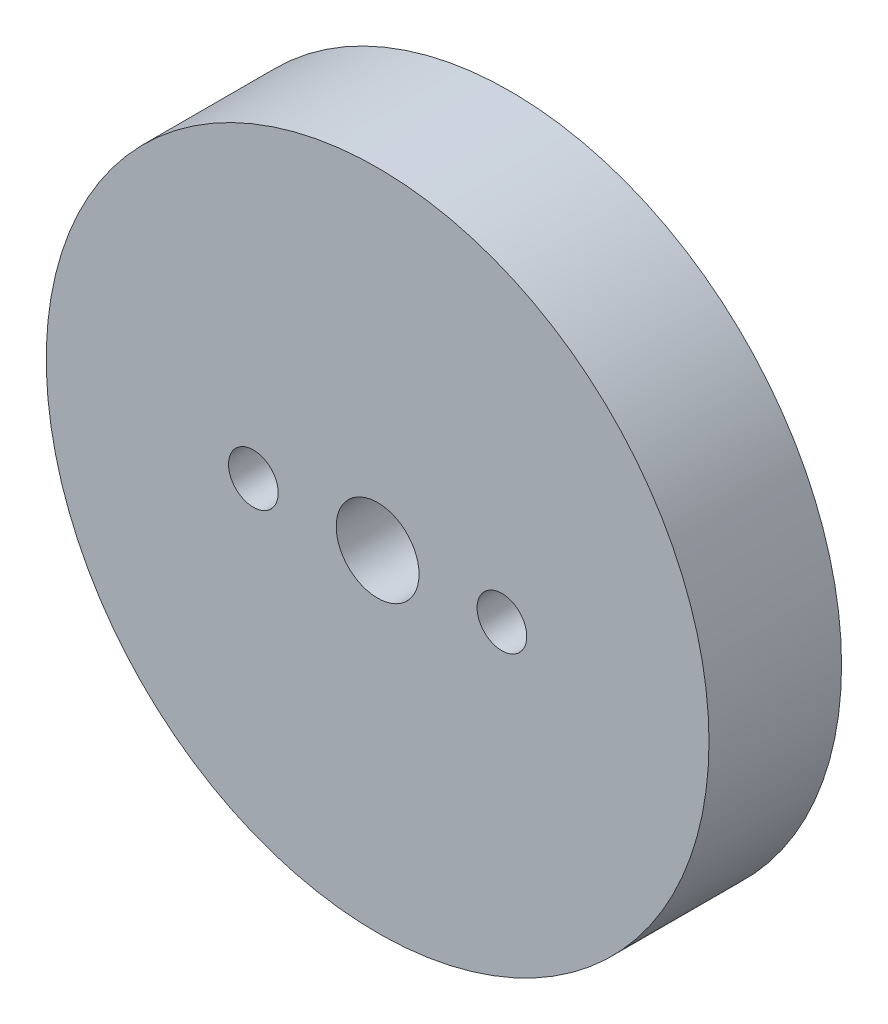
ISO-10303-21;
HEADER;
FILE_DESCRIPTION(('STEP AP214'),'2;1');
FILE_NAME('part.step','',(''),(''),'','','');
FILE_SCHEMA(('AUTOMOTIVE_DESIGN { 1 0 10303 214 1 1 1 1 }'));
ENDSEC;
DATA;
#1=APPLICATION_CONTEXT('core data for automotive mechanical design processes');
#2=APPLICATION_PROTOCOL_DEFINITION('international standard','automotive_design',2000,#1);
#3=PRODUCT_CONTEXT('',#1,'mechanical');
#4=PRODUCT('Part','Part','',(#3));
#5=PRODUCT_RELATED_PRODUCT_CATEGORY('part','',(#4));
#6=PRODUCT_DEFINITION_FORMATION('','',#4);
#7=PRODUCT_DEFINITION_CONTEXT('part definition',#1,'design');
#8=PRODUCT_DEFINITION('design','',#6,#7);
#9=PRODUCT_DEFINITION_SHAPE('','',#8);
#10=(LENGTH_UNIT() NAMED_UNIT(*) SI_UNIT(.MILLI.,.METRE.));
#11=(NAMED_UNIT(*) PLANE_ANGLE_UNIT() SI_UNIT($,.RADIAN.));
#12=(NAMED_UNIT(*) SI_UNIT($,.STERADIAN.) SOLID_ANGLE_UNIT());
#13=UNCERTAINTY_MEASURE_WITH_UNIT(LENGTH_MEASURE(1.E-05),#10,'distance_accuracy_value','');
#14=(GEOMETRIC_REPRESENTATION_CONTEXT(3) GLOBAL_UNCERTAINTY_ASSIGNED_CONTEXT((#13)) GLOBAL_UNIT_ASSIGNED_CONTEXT((#10,
#11,#12)) REPRESENTATION_CONTEXT('',''));
#15=CARTESIAN_POINT('',(0.,0.,0.));
#16=DIRECTION('',(0.,0.,1.));
#17=DIRECTION('',(1.,0.,0.));
#18=AXIS2_PLACEMENT_3D('',#15,#16,#17);
#19=CARTESIAN_POINT('',(0.,0.,8.));
#20=DIRECTION('',(0.,0.,1.));
#21=DIRECTION('',(1.,0.,0.));
#22=AXIS2_PLACEMENT_3D('',#19,#20,#21);
#23=PLANE('',#22);
#24=CARTESIAN_POINT('',(7.5,0.,8.));
#25=DIRECTION('',(0.,0.,1.));
#26=DIRECTION('',(1.,0.,0.));
#27=AXIS2_PLACEMENT_3D('',#24,#25,#26);
#28=CIRCLE('',#27,1.5);
#29=CARTESIAN_POINT('',(9.,0.,8.));
#30=VERTEX_POINT('',#29);
#31=EDGE_CURVE('E47',#30,#30,#28,.T.);
#32=ORIENTED_EDGE('',*,*,#31,.F.);
#33=EDGE_LOOP('',(#32));
#34=FACE_BOUND('',#33,.T.);
#35=CARTESIAN_POINT('',(0.,0.,8.));
#36=DIRECTION('',(0.,0.,1.));
#37=DIRECTION('',(1.,0.,0.));
#38=AXIS2_PLACEMENT_3D('',#35,#36,#37);
#39=CIRCLE('',#38,20.);
#40=CARTESIAN_POINT('',(20.,0.,8.));
#41=VERTEX_POINT('',#40);
#42=EDGE_CURVE('E10',#41,#41,#39,.T.);
#43=ORIENTED_EDGE('',*,*,#42,.T.);
#44=EDGE_LOOP('',(#43));
#45=FACE_BOUND('',#44,.T.);
#46=CARTESIAN_POINT('',(0.,0.,8.));
#47=DIRECTION('',(0.,0.,1.));
#48=DIRECTION('',(1.,0.,0.));
#49=AXIS2_PLACEMENT_3D('',#46,#47,#48);
#50=CIRCLE('',#49,2.5);
#51=CARTESIAN_POINT('',(2.5,0.,8.));
#52=VERTEX_POINT('',#51);
#53=EDGE_CURVE('E42',#52,#52,#50,.T.);
#54=ORIENTED_EDGE('',*,*,#53,.F.);
#55=EDGE_LOOP('',(#54));
#56=FACE_BOUND('',#55,.T.);
#57=CARTESIAN_POINT('',(-7.5,0.,8.));
#58=DIRECTION('',(0.,0.,1.));
#59=DIRECTION('',(1.,0.,0.));
#60=AXIS2_PLACEMENT_3D('',#57,#58,#59);
#61=CIRCLE('',#60,1.5);
#62=CARTESIAN_POINT('',(-6.,0.,8.));
#63=VERTEX_POINT('',#62);
#64=EDGE_CURVE('E53',#63,#63,#61,.T.);
#65=ORIENTED_EDGE('',*,*,#64,.F.);
#66=EDGE_LOOP('',(#65));
#67=FACE_BOUND('',#66,.T.);
#68=ADVANCED_FACE('F31',(#34,#45,#56,#67),#23,.T.);
#69=CARTESIAN_POINT('',(0.,0.,0.));
#70=DIRECTION('',(0.,0.,1.));
#71=DIRECTION('',(1.,0.,0.));
#72=AXIS2_PLACEMENT_3D('',#69,#70,#71);
#73=PLANE('',#72);
#74=CARTESIAN_POINT('',(7.5,0.,0.));
#75=DIRECTION('',(0.,0.,1.));
#76=DIRECTION('',(1.,0.,0.));
#77=AXIS2_PLACEMENT_3D('',#74,#75,#76);
#78=CIRCLE('',#77,1.5);
#79=CARTESIAN_POINT('',(9.,0.,0.));
#80=VERTEX_POINT('',#79);
#81=EDGE_CURVE('E50',#80,#80,#78,.T.);
#82=ORIENTED_EDGE('',*,*,#81,.T.);
#83=EDGE_LOOP('',(#82));
#84=FACE_BOUND('',#83,.T.);
#85=CARTESIAN_POINT('',(0.,0.,0.));
#86=DIRECTION('',(0.,0.,1.));
#87=DIRECTION('',(1.,0.,0.));
#88=AXIS2_PLACEMENT_3D('',#85,#86,#87);
#89=CIRCLE('',#88,20.);
#90=CARTESIAN_POINT('',(20.,0.,0.));
#91=VERTEX_POINT('',#90);
#92=EDGE_CURVE('E35',#91,#91,#89,.T.);
#93=ORIENTED_EDGE('',*,*,#92,.F.);
#94=EDGE_LOOP('',(#93));
#95=FACE_BOUND('',#94,.T.);
#96=CARTESIAN_POINT('',(0.,0.,0.));
#97=DIRECTION('',(0.,0.,1.));
#98=DIRECTION('',(1.,0.,0.));
#99=AXIS2_PLACEMENT_3D('',#96,#97,#98);
#100=CIRCLE('',#99,2.5);
#101=CARTESIAN_POINT('',(2.5,0.,0.));
#102=VERTEX_POINT('',#101);
#103=EDGE_CURVE('E44',#102,#102,#100,.T.);
#104=ORIENTED_EDGE('',*,*,#103,.T.);
#105=EDGE_LOOP('',(#104));
#106=FACE_BOUND('',#105,.T.);
#107=CARTESIAN_POINT('',(-7.5,0.,0.));
#108=DIRECTION('',(0.,0.,1.));
#109=DIRECTION('',(1.,0.,0.));
#110=AXIS2_PLACEMENT_3D('',#107,#108,#109);
#111=CIRCLE('',#110,1.5);
#112=CARTESIAN_POINT('',(-6.,0.,0.));
#113=VERTEX_POINT('',#112);
#114=EDGE_CURVE('E56',#113,#113,#111,.T.);
#115=ORIENTED_EDGE('',*,*,#114,.T.);
#116=EDGE_LOOP('',(#115));
#117=FACE_BOUND('',#116,.T.);
#118=ADVANCED_FACE('F66',(#84,#95,#106,#117),#73,.F.);
#119=CARTESIAN_POINT('',(0.,0.,8.));
#120=DIRECTION('',(0.,0.,-1.));
#121=DIRECTION('',(-1.,0.,0.));
#122=AXIS2_PLACEMENT_3D('',#119,#120,#121);
#123=CYLINDRICAL_SURFACE('',#122,20.);
#124=ORIENTED_EDGE('',*,*,#42,.F.);
#125=EDGE_LOOP('',(#124));
#126=FACE_BOUND('',#125,.T.);
#127=ORIENTED_EDGE('',*,*,#92,.T.);
#128=EDGE_LOOP('',(#127));
#129=FACE_BOUND('',#128,.T.);
#130=ADVANCED_FACE('F33',(#126,#129),#123,.T.);
#131=CARTESIAN_POINT('',(0.,0.,8.));
#132=DIRECTION('',(0.,0.,-1.));
#133=DIRECTION('',(-1.,0.,0.));
#134=AXIS2_PLACEMENT_3D('',#131,#132,#133);
#135=CYLINDRICAL_SURFACE('',#134,2.5);
#136=ORIENTED_EDGE('',*,*,#53,.T.);
#137=EDGE_LOOP('',(#136));
#138=FACE_BOUND('',#137,.T.);
#139=ORIENTED_EDGE('',*,*,#103,.F.);
#140=EDGE_LOOP('',(#139));
#141=FACE_BOUND('',#140,.T.);
#142=ADVANCED_FACE('F75',(#138,#141),#135,.F.);
#143=CARTESIAN_POINT('',(7.5,0.,8.));
#144=DIRECTION('',(0.,0.,-1.));
#145=DIRECTION('',(-1.,0.,0.));
#146=AXIS2_PLACEMENT_3D('',#143,#144,#145);
#147=CYLINDRICAL_SURFACE('',#146,1.5);
#148=ORIENTED_EDGE('',*,*,#31,.T.);
#149=EDGE_LOOP('',(#148));
#150=FACE_BOUND('',#149,.T.);
#151=ORIENTED_EDGE('',*,*,#81,.F.);
#152=EDGE_LOOP('',(#151));
#153=FACE_BOUND('',#152,.T.);
#154=ADVANCED_FACE('F78',(#150,#153),#147,.F.);
#155=CARTESIAN_POINT('',(-7.5,0.,8.));
#156=DIRECTION('',(0.,0.,-1.));
#157=DIRECTION('',(-1.,0.,0.));
#158=AXIS2_PLACEMENT_3D('',#155,#156,#157);
#159=CYLINDRICAL_SURFACE('',#158,1.5);
#160=ORIENTED_EDGE('',*,*,#64,.T.);
#161=EDGE_LOOP('',(#160));
#162=FACE_BOUND('',#161,.T.);
#163=ORIENTED_EDGE('',*,*,#114,.F.);
#164=EDGE_LOOP('',(#163));
#165=FACE_BOUND('',#164,.T.);
#166=ADVANCED_FACE('F62',(#162,#165),#159,.F.);
#167=CLOSED_SHELL('',(#68,#118,#130,#142,#154,#166));
#168=MANIFOLD_SOLID_BREP('B2',#167);
#169=ADVANCED_BREP_SHAPE_REPRESENTATION('',(#18,#168),#14);
#170=SHAPE_DEFINITION_REPRESENTATION(#9,#169);
ENDSEC;
END-ISO-10303-21;
